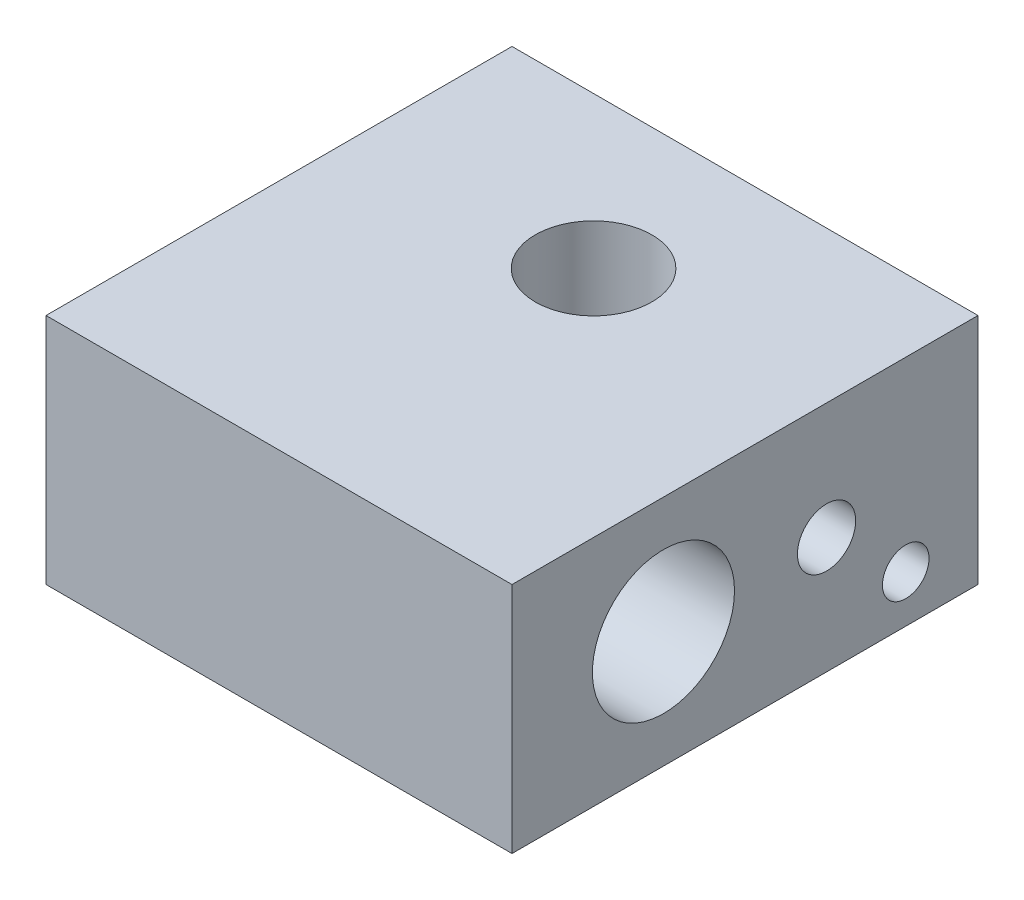
ISO-10303-21;
HEADER;
FILE_DESCRIPTION(('STEP AP214'),'2;1');
FILE_NAME('part.step','',(''),(''),'','','');
FILE_SCHEMA(('AUTOMOTIVE_DESIGN { 1 0 10303 214 1 1 1 1 }'));
ENDSEC;
DATA;
#1=APPLICATION_CONTEXT('core data for automotive mechanical design processes');
#2=APPLICATION_PROTOCOL_DEFINITION('international standard','automotive_design',2000,#1);
#3=PRODUCT_CONTEXT('',#1,'mechanical');
#4=PRODUCT('Part','Part','',(#3));
#5=PRODUCT_RELATED_PRODUCT_CATEGORY('part','',(#4));
#6=PRODUCT_DEFINITION_FORMATION('','',#4);
#7=PRODUCT_DEFINITION_CONTEXT('part definition',#1,'design');
#8=PRODUCT_DEFINITION('design','',#6,#7);
#9=PRODUCT_DEFINITION_SHAPE('','',#8);
#10=(LENGTH_UNIT() NAMED_UNIT(*) SI_UNIT(.MILLI.,.METRE.));
#11=(NAMED_UNIT(*) PLANE_ANGLE_UNIT() SI_UNIT($,.RADIAN.));
#12=(NAMED_UNIT(*) SI_UNIT($,.STERADIAN.) SOLID_ANGLE_UNIT());
#13=UNCERTAINTY_MEASURE_WITH_UNIT(LENGTH_MEASURE(1.E-05),#10,'distance_accuracy_value','');
#14=(GEOMETRIC_REPRESENTATION_CONTEXT(3) GLOBAL_UNCERTAINTY_ASSIGNED_CONTEXT((#13)) GLOBAL_UNIT_ASSIGNED_CONTEXT((#10,
#11,#12)) REPRESENTATION_CONTEXT('',''));
#15=CARTESIAN_POINT('',(0.,0.,0.));
#16=DIRECTION('',(0.,0.,1.));
#17=DIRECTION('',(1.,0.,0.));
#18=AXIS2_PLACEMENT_3D('',#15,#16,#17);
#19=CARTESIAN_POINT('',(-10.,10.,10.));
#20=DIRECTION('',(1.,0.,0.));
#21=DIRECTION('',(0.,0.,-1.));
#22=AXIS2_PLACEMENT_3D('',#19,#20,#21);
#23=PLANE('',#22);
#24=CARTESIAN_POINT('',(-10.,5.,3.5));
#25=DIRECTION('',(1.,0.,0.));
#26=DIRECTION('',(0.,0.,-1.));
#27=AXIS2_PLACEMENT_3D('',#24,#25,#26);
#28=CIRCLE('',#27,3.05);
#29=CARTESIAN_POINT('',(-10.,5.,0.45));
#30=VERTEX_POINT('',#29);
#31=EDGE_CURVE('E106',#30,#30,#28,.T.);
#32=ORIENTED_EDGE('',*,*,#31,.T.);
#33=EDGE_LOOP('',(#32));
#34=FACE_BOUND('',#33,.T.);
#35=DIRECTION('',(0.,0.,1.));
#36=VECTOR('',#35,1.);
#37=CARTESIAN_POINT('',(-10.,0.,10.));
#38=LINE('',#37,#36);
#39=CARTESIAN_POINT('',(-10.,0.,-10.));
#40=VERTEX_POINT('',#39);
#41=CARTESIAN_POINT('',(-10.,0.,10.));
#42=VERTEX_POINT('',#41);
#43=EDGE_CURVE('E87',#40,#42,#38,.T.);
#44=ORIENTED_EDGE('',*,*,#43,.T.);
#45=DIRECTION('',(0.,-1.,0.));
#46=VECTOR('',#45,1.);
#47=CARTESIAN_POINT('',(-10.,10.,10.));
#48=LINE('',#47,#46);
#49=CARTESIAN_POINT('',(-10.,10.,10.));
#50=VERTEX_POINT('',#49);
#51=EDGE_CURVE('E11',#50,#42,#48,.T.);
#52=ORIENTED_EDGE('',*,*,#51,.F.);
#53=DIRECTION('',(0.,0.,1.));
#54=VECTOR('',#53,1.);
#55=CARTESIAN_POINT('',(-10.,10.,10.));
#56=LINE('',#55,#54);
#57=CARTESIAN_POINT('',(-10.,10.,-10.));
#58=VERTEX_POINT('',#57);
#59=EDGE_CURVE('E74',#58,#50,#56,.T.);
#60=ORIENTED_EDGE('',*,*,#59,.F.);
#61=DIRECTION('',(0.,-1.,0.));
#62=VECTOR('',#61,1.);
#63=CARTESIAN_POINT('',(-10.,10.,-10.));
#64=LINE('',#63,#62);
#65=EDGE_CURVE('E83',#58,#40,#64,.T.);
#66=ORIENTED_EDGE('',*,*,#65,.T.);
#67=EDGE_LOOP('',(#44,#52,#60,#66));
#68=FACE_BOUND('',#67,.T.);
#69=ADVANCED_FACE('F17',(#34,#68),#23,.F.);
#70=CARTESIAN_POINT('',(10.,10.,10.));
#71=DIRECTION('',(0.,0.,-1.));
#72=DIRECTION('',(-1.,0.,0.));
#73=AXIS2_PLACEMENT_3D('',#70,#71,#72);
#74=PLANE('',#73);
#75=DIRECTION('',(1.,0.,0.));
#76=VECTOR('',#75,1.);
#77=CARTESIAN_POINT('',(10.,0.,10.));
#78=LINE('',#77,#76);
#79=CARTESIAN_POINT('',(10.,0.,10.));
#80=VERTEX_POINT('',#79);
#81=EDGE_CURVE('E78',#42,#80,#78,.T.);
#82=ORIENTED_EDGE('',*,*,#81,.T.);
#83=DIRECTION('',(0.,-1.,0.));
#84=VECTOR('',#83,1.);
#85=CARTESIAN_POINT('',(10.,10.,10.));
#86=LINE('',#85,#84);
#87=CARTESIAN_POINT('',(10.,10.,10.));
#88=VERTEX_POINT('',#87);
#89=EDGE_CURVE('E31',#88,#80,#86,.T.);
#90=ORIENTED_EDGE('',*,*,#89,.F.);
#91=DIRECTION('',(1.,0.,0.));
#92=VECTOR('',#91,1.);
#93=CARTESIAN_POINT('',(10.,10.,10.));
#94=LINE('',#93,#92);
#95=EDGE_CURVE('E69',#50,#88,#94,.T.);
#96=ORIENTED_EDGE('',*,*,#95,.F.);
#97=ORIENTED_EDGE('',*,*,#51,.T.);
#98=EDGE_LOOP('',(#82,#90,#96,#97));
#99=FACE_BOUND('',#98,.T.);
#100=ADVANCED_FACE('F77',(#99),#74,.F.);
#101=CARTESIAN_POINT('',(10.,10.,10.));
#102=DIRECTION('',(-1.,0.,0.));
#103=DIRECTION('',(0.,0.,1.));
#104=AXIS2_PLACEMENT_3D('',#101,#102,#103);
#105=PLANE('',#104);
#106=CARTESIAN_POINT('',(10.,2.02444947649937,-6.89833512368675));
#107=DIRECTION('',(1.,0.,0.));
#108=DIRECTION('',(0.,0.,-1.));
#109=AXIS2_PLACEMENT_3D('',#106,#107,#108);
#110=CIRCLE('',#109,1.);
#111=CARTESIAN_POINT('',(10.,2.02444947649937,-7.89833512368675));
#112=VERTEX_POINT('',#111);
#113=EDGE_CURVE('E195',#112,#112,#110,.T.);
#114=ORIENTED_EDGE('',*,*,#113,.F.);
#115=EDGE_LOOP('',(#114));
#116=FACE_BOUND('',#115,.T.);
#117=CARTESIAN_POINT('',(10.,5.,-3.5));
#118=DIRECTION('',(1.,0.,0.));
#119=DIRECTION('',(0.,0.,-1.));
#120=AXIS2_PLACEMENT_3D('',#117,#118,#119);
#121=CIRCLE('',#120,1.25);
#122=CARTESIAN_POINT('',(10.,5.,-4.75));
#123=VERTEX_POINT('',#122);
#124=EDGE_CURVE('E190',#123,#123,#121,.T.);
#125=ORIENTED_EDGE('',*,*,#124,.F.);
#126=EDGE_LOOP('',(#125));
#127=FACE_BOUND('',#126,.T.);
#128=CARTESIAN_POINT('',(10.,5.,3.5));
#129=DIRECTION('',(1.,0.,0.));
#130=DIRECTION('',(0.,0.,-1.));
#131=AXIS2_PLACEMENT_3D('',#128,#129,#130);
#132=CIRCLE('',#131,3.05);
#133=CARTESIAN_POINT('',(10.,5.,0.45));
#134=VERTEX_POINT('',#133);
#135=EDGE_CURVE('E109',#134,#134,#132,.T.);
#136=ORIENTED_EDGE('',*,*,#135,.F.);
#137=EDGE_LOOP('',(#136));
#138=FACE_BOUND('',#137,.T.);
#139=DIRECTION('',(0.,0.,-1.));
#140=VECTOR('',#139,1.);
#141=CARTESIAN_POINT('',(10.,0.,10.));
#142=LINE('',#141,#140);
#143=CARTESIAN_POINT('',(10.,0.,-10.));
#144=VERTEX_POINT('',#143);
#145=EDGE_CURVE('E56',#80,#144,#142,.T.);
#146=ORIENTED_EDGE('',*,*,#145,.T.);
#147=DIRECTION('',(0.,-1.,0.));
#148=VECTOR('',#147,1.);
#149=CARTESIAN_POINT('',(10.,10.,-10.));
#150=LINE('',#149,#148);
#151=CARTESIAN_POINT('',(10.,10.,-10.));
#152=VERTEX_POINT('',#151);
#153=EDGE_CURVE('E79',#152,#144,#150,.T.);
#154=ORIENTED_EDGE('',*,*,#153,.F.);
#155=DIRECTION('',(0.,0.,-1.));
#156=VECTOR('',#155,1.);
#157=CARTESIAN_POINT('',(10.,10.,10.));
#158=LINE('',#157,#156);
#159=EDGE_CURVE('E72',#88,#152,#158,.T.);
#160=ORIENTED_EDGE('',*,*,#159,.F.);
#161=ORIENTED_EDGE('',*,*,#89,.T.);
#162=EDGE_LOOP('',(#146,#154,#160,#161));
#163=FACE_BOUND('',#162,.T.);
#164=ADVANCED_FACE('F81',(#116,#127,#138,#163),#105,.F.);
#165=CARTESIAN_POINT('',(10.,10.,-10.));
#166=DIRECTION('',(0.,0.,1.));
#167=DIRECTION('',(1.,0.,0.));
#168=AXIS2_PLACEMENT_3D('',#165,#166,#167);
#169=PLANE('',#168);
#170=DIRECTION('',(-1.,0.,0.));
#171=VECTOR('',#170,1.);
#172=CARTESIAN_POINT('',(10.,0.,-10.));
#173=LINE('',#172,#171);
#174=EDGE_CURVE('E62',#144,#40,#173,.T.);
#175=ORIENTED_EDGE('',*,*,#174,.T.);
#176=ORIENTED_EDGE('',*,*,#65,.F.);
#177=DIRECTION('',(-1.,0.,0.));
#178=VECTOR('',#177,1.);
#179=CARTESIAN_POINT('',(10.,10.,-10.));
#180=LINE('',#179,#178);
#181=EDGE_CURVE('E39',#152,#58,#180,.T.);
#182=ORIENTED_EDGE('',*,*,#181,.F.);
#183=ORIENTED_EDGE('',*,*,#153,.T.);
#184=EDGE_LOOP('',(#175,#176,#182,#183));
#185=FACE_BOUND('',#184,.T.);
#186=ADVANCED_FACE('F95',(#185),#169,.F.);
#187=CARTESIAN_POINT('',(0.,10.,0.));
#188=DIRECTION('',(0.,1.,0.));
#189=DIRECTION('',(0.,0.,1.));
#190=AXIS2_PLACEMENT_3D('',#187,#188,#189);
#191=PLANE('',#190);
#192=CARTESIAN_POINT('',(0.,10.,-3.5));
#193=DIRECTION('',(0.,1.,0.));
#194=DIRECTION('',(0.,0.,1.));
#195=AXIS2_PLACEMENT_3D('',#192,#193,#194);
#196=CIRCLE('',#195,2.5);
#197=CARTESIAN_POINT('',(0.,10.,-1.));
#198=VERTEX_POINT('',#197);
#199=EDGE_CURVE('E103',#198,#198,#196,.T.);
#200=ORIENTED_EDGE('',*,*,#199,.F.);
#201=EDGE_LOOP('',(#200));
#202=FACE_BOUND('',#201,.T.);
#203=ORIENTED_EDGE('',*,*,#59,.T.);
#204=ORIENTED_EDGE('',*,*,#95,.T.);
#205=ORIENTED_EDGE('',*,*,#159,.T.);
#206=ORIENTED_EDGE('',*,*,#181,.T.);
#207=EDGE_LOOP('',(#203,#204,#205,#206));
#208=FACE_BOUND('',#207,.T.);
#209=ADVANCED_FACE('F70',(#202,#208),#191,.T.);
#210=CARTESIAN_POINT('',(0.,0.,0.));
#211=DIRECTION('',(0.,1.,0.));
#212=DIRECTION('',(0.,0.,1.));
#213=AXIS2_PLACEMENT_3D('',#210,#211,#212);
#214=PLANE('',#213);
#215=CARTESIAN_POINT('',(0.,0.,4.));
#216=DIRECTION('',(0.,-1.,0.));
#217=DIRECTION('',(0.,0.,-1.));
#218=AXIS2_PLACEMENT_3D('',#215,#216,#217);
#219=CIRCLE('',#218,1.25);
#220=CARTESIAN_POINT('',(0.,0.,2.75));
#221=VERTEX_POINT('',#220);
#222=EDGE_CURVE('E120',#221,#221,#219,.T.);
#223=ORIENTED_EDGE('',*,*,#222,.F.);
#224=EDGE_LOOP('',(#223));
#225=FACE_BOUND('',#224,.T.);
#226=CARTESIAN_POINT('',(0.,0.,-3.5));
#227=DIRECTION('',(0.,1.,0.));
#228=DIRECTION('',(0.,0.,1.));
#229=AXIS2_PLACEMENT_3D('',#226,#227,#228);
#230=CIRCLE('',#229,2.5);
#231=CARTESIAN_POINT('',(0.,0.,-1.));
#232=VERTEX_POINT('',#231);
#233=EDGE_CURVE('E90',#232,#232,#230,.T.);
#234=ORIENTED_EDGE('',*,*,#233,.T.);
#235=EDGE_LOOP('',(#234));
#236=FACE_BOUND('',#235,.T.);
#237=ORIENTED_EDGE('',*,*,#43,.F.);
#238=ORIENTED_EDGE('',*,*,#174,.F.);
#239=ORIENTED_EDGE('',*,*,#145,.F.);
#240=ORIENTED_EDGE('',*,*,#81,.F.);
#241=EDGE_LOOP('',(#237,#238,#239,#240));
#242=FACE_BOUND('',#241,.T.);
#243=ADVANCED_FACE('F98',(#225,#236,#242),#214,.F.);
#244=CARTESIAN_POINT('',(0.,10.,-3.5));
#245=DIRECTION('',(0.,1.,0.));
#246=DIRECTION('',(0.,0.,1.));
#247=AXIS2_PLACEMENT_3D('',#244,#245,#246);
#248=CYLINDRICAL_SURFACE('',#247,2.5);
#249=CARTESIAN_POINT('',(2.1650635094611,5.,-4.75));
#250=CARTESIAN_POINT('',(2.16506918410574,5.06513476024406,-4.74999545384316));
#251=CARTESIAN_POINT('',(2.16804751484696,5.13035176440631,-4.74487496341652));
#252=CARTESIAN_POINT('',(2.17952958065065,5.25878408084644,-4.72465401237256));
#253=CARTESIAN_POINT('',(2.18804492569449,5.32199489380426,-4.70953258069271));
#254=CARTESIAN_POINT('',(2.20936683256748,5.44431458042992,-4.67012493587476));
#255=CARTESIAN_POINT('',(2.22215054341565,5.50344331559199,-4.64588744061716));
#256=CARTESIAN_POINT('',(2.25053331021072,5.6167802524959,-4.58908440672047));
#257=CARTESIAN_POINT('',(2.26613251845081,5.67098818782807,-4.55651841754471));
#258=CARTESIAN_POINT('',(2.29996086321802,5.77788216069688,-4.48083317566359));
#259=CARTESIAN_POINT('',(2.31830079547442,5.83007391959193,-4.43706504517971));
#260=CARTESIAN_POINT('',(2.35464978482132,5.92676048550839,-4.34156725951808));
#261=CARTESIAN_POINT('',(2.37265867289062,5.9712514532294,-4.28983365722786));
#262=CARTESIAN_POINT('',(2.40776846191186,6.05420893893458,-4.17561195426818));
#263=CARTESIAN_POINT('',(2.42472633022716,6.09206720982441,-4.11263398626572));
#264=CARTESIAN_POINT('',(2.45438445124411,6.1564260665572,-3.98019628324938));
#265=CARTESIAN_POINT('',(2.46708738979677,6.18293382017146,-3.91074067267269));
#266=CARTESIAN_POINT('',(2.48600576555297,6.22188082662637,-3.77255617990747));
#267=CARTESIAN_POINT('',(2.49261850276115,6.23518690794442,-3.70412723811102));
#268=CARTESIAN_POINT('',(2.50009479807584,6.2502076483438,-3.56571328587231));
#269=CARTESIAN_POINT('',(2.50096183480737,6.25192932099463,-3.49572924269533));
#270=CARTESIAN_POINT('',(2.49703727395562,6.24406665753706,-3.36270934447031));
#271=CARTESIAN_POINT('',(2.492731198652,6.23545248059847,-3.29959850102901));
#272=CARTESIAN_POINT('',(2.47967806574684,6.20889894511918,-3.1758577851021));
#273=CARTESIAN_POINT('',(2.47093067582992,6.19095888877972,-3.1152280986326));
#274=CARTESIAN_POINT('',(2.44964479109568,6.14614679238773,-2.99711326053806));
#275=CARTESIAN_POINT('',(2.43705551911499,6.11915460853492,-2.93968322060603));
#276=CARTESIAN_POINT('',(2.40922057483359,6.05717072974813,-2.83002899810834));
#277=CARTESIAN_POINT('',(2.39397395196855,6.02217617087205,-2.7778066889517));
#278=CARTESIAN_POINT('',(2.36055492999036,5.94138081058372,-2.67478292387726));
#279=CARTESIAN_POINT('',(2.34224219997719,5.89487121459248,-2.6245824062133));
#280=CARTESIAN_POINT('',(2.30567925733514,5.79426284383728,-2.53236953712777));
#281=CARTESIAN_POINT('',(2.28742910332036,5.74015828465742,-2.49036348553221));
#282=CARTESIAN_POINT('',(2.25180195115606,5.62168975946988,-2.41311833169724));
#283=CARTESIAN_POINT('',(2.23455399988384,5.55689247118223,-2.37847835627743));
#284=CARTESIAN_POINT('',(2.2046931284822,5.42132791080125,-2.32085110874846));
#285=CARTESIAN_POINT('',(2.19207537557584,5.35056695872804,-2.29785167723639));
#286=CARTESIAN_POINT('',(2.17430794771293,5.21098186089651,-2.26602473621871));
#287=CARTESIAN_POINT('',(2.1686456981062,5.14244860119556,-2.25621859735003));
#288=CARTESIAN_POINT('',(2.16397399202012,5.00449832310433,-2.24810381673572));
#289=CARTESIAN_POINT('',(2.1649598361164,4.93508196360027,-2.24978705335622));
#290=CARTESIAN_POINT('',(2.17292920675731,4.80543260177659,-2.26370494582005));
#291=CARTESIAN_POINT('',(2.17924484383318,4.74502568611509,-2.27476522910941));
#292=CARTESIAN_POINT('',(2.19617526939176,4.62704026716131,-2.30537964420945));
#293=CARTESIAN_POINT('',(2.20679145006292,4.56946268656675,-2.32493652672049));
#294=CARTESIAN_POINT('',(2.23170277599571,4.45573583637163,-2.3729405142439));
#295=CARTESIAN_POINT('',(2.24614554053829,4.39977622893306,-2.4017574203841));
#296=CARTESIAN_POINT('',(2.27695149371562,4.29316341057626,-2.46714116998024));
#297=CARTESIAN_POINT('',(2.29331566693934,4.2425129456084,-2.50371199458474));
#298=CARTESIAN_POINT('',(2.3285999807042,4.14127654059557,-2.58895354100144));
#299=CARTESIAN_POINT('',(2.34758228942861,4.09150356160293,-2.63856840960629));
#300=CARTESIAN_POINT('',(2.38417793722365,4.00073470250801,-2.74574438075214));
#301=CARTESIAN_POINT('',(2.40179081259636,3.95974178721183,-2.80330815668082));
#302=CARTESIAN_POINT('',(2.43426702113696,3.88678284256238,-2.92683079680156));
#303=CARTESIAN_POINT('',(2.44904552090037,3.85508360223636,-2.99297112803236));
#304=CARTESIAN_POINT('',(2.47354193699126,3.80357762017826,-3.13059704419865));
#305=CARTESIAN_POINT('',(2.48326429595466,3.78376043579212,-3.20207787325978));
#306=CARTESIAN_POINT('',(2.49584385227353,3.75828929478168,-3.34127539708698));
#307=CARTESIAN_POINT('',(2.49924909885239,3.75150265515486,-3.40873569518693));
#308=CARTESIAN_POINT('',(2.50052662968914,3.748945918182,-3.54390748243901));
#309=CARTESIAN_POINT('',(2.49840085083612,3.75317196434555,-3.61161887536886));
#310=CARTESIAN_POINT('',(2.48917461047403,3.77177050849454,-3.74067249039644));
#311=CARTESIAN_POINT('',(2.48241118334987,3.78545606157209,-3.80214039726408));
#312=CARTESIAN_POINT('',(2.46490117079279,3.82165874912871,-3.92180744022953));
#313=CARTESIAN_POINT('',(2.45415401415994,3.84417715011682,-3.98000610619439));
#314=CARTESIAN_POINT('',(2.4290741343515,3.89840881520747,-4.09427925780611));
#315=CARTESIAN_POINT('',(2.41460771498499,3.9304741540098,-4.15015642837506));
#316=CARTESIAN_POINT('',(2.38360166427283,4.00244741357382,-4.25596830226753));
#317=CARTESIAN_POINT('',(2.36706108197951,4.0423589363946,-4.30590025926864));
#318=CARTESIAN_POINT('',(2.33160762783285,4.13349642377838,-4.40364250519611));
#319=CARTESIAN_POINT('',(2.31262248764622,4.18545310934649,-4.45074710567409));
#320=CARTESIAN_POINT('',(2.27578845203565,4.29681340141221,-4.53582910924334));
#321=CARTESIAN_POINT('',(2.25794057202332,4.35622352608461,-4.57379843751257));
#322=CARTESIAN_POINT('',(2.22499506631145,4.4832958082262,-4.64053884973206));
#323=CARTESIAN_POINT('',(2.21000217820338,4.55115941391092,-4.66898133245118));
#324=CARTESIAN_POINT('',(2.18582695410439,4.69166550542472,-4.71359838688301));
#325=CARTESIAN_POINT('',(2.17662520184627,4.76429111114086,-4.72981398896917));
#326=CARTESIAN_POINT('',(2.16911590752238,4.864756694565,-4.74295875983051));
#327=CARTESIAN_POINT('',(2.1676016125644,4.89170986799735,-4.74559513120481));
#328=CARTESIAN_POINT('',(2.16557419859688,4.9457706008528,-4.74911675636246));
#329=CARTESIAN_POINT('',(2.16506114656387,4.97287817048234,-4.75000189299984));
#330=CARTESIAN_POINT('',(2.1650635094611,5.,-4.75));
#331=B_SPLINE_CURVE_WITH_KNOTS('',3,(#249,#250,#251,#252,#253,#254,#255,#256,#257,#258,#259,
#260,#261,#262,#263,#264,#265,#266,#267,#268,#269,#270,#271,#272,#273,#274,#275,#276,#277,#278,
#279,#280,#281,#282,#283,#284,#285,#286,#287,#288,#289,#290,#291,#292,#293,#294,#295,#296,#297,
#298,#299,#300,#301,#302,#303,#304,#305,#306,#307,#308,#309,#310,#311,#312,#313,#314,#315,#316,
#317,#318,#319,#320,#321,#322,#323,#324,#325,#326,#327,#328,#329,#330),.UNSPECIFIED.,.T.,.F.,(4,
2,2,2,2,2,2,2,2,2,2,2,2,2,2,2,2,2,2,2,2,2,2,2,2,2,2,2,2,2,2,2,2,2,2,2,2,2,2,2,4),(0.,
0.195290153243392,0.390991116031006,0.585660744898607,0.780340906806435,0.991077890622791,
1.20191963855464,1.42697365298454,1.65188533704863,1.86079356209919,2.0695752960755,
2.26020121855673,2.45084140646818,2.64411918413933,2.83746624187839,3.04908989321113,
3.26087560307398,3.4861105216181,3.7111096776463,3.91827863567764,4.12530116485465,
4.3096772928003,4.49411315545077,4.68709120507608,4.88016857775058,5.09758429475765,
5.31507331222751,5.53830226766206,5.76133474760963,5.96390337986857,6.16640108492463,
6.35555531089364,6.54473666890015,6.74200938399339,6.93937287625897,7.15637802312583,
7.37357428556441,7.59763436298254,7.82093916253448,7.90225168981634,7.98356965618173),.UNSPECIFIED.);
#332=CARTESIAN_POINT('',(2.1650635094611,5.,-4.75));
#333=VERTEX_POINT('',#332);
#334=EDGE_CURVE('E20',#333,#333,#331,.T.);
#335=ORIENTED_EDGE('',*,*,#334,.T.);
#336=EDGE_LOOP('',(#335));
#337=FACE_BOUND('',#336,.T.);
#338=ORIENTED_EDGE('',*,*,#233,.F.);
#339=EDGE_LOOP('',(#338));
#340=FACE_BOUND('',#339,.T.);
#341=ORIENTED_EDGE('',*,*,#199,.T.);
#342=EDGE_LOOP('',(#341));
#343=FACE_BOUND('',#342,.T.);
#344=ADVANCED_FACE('F156',(#337,#340,#343),#248,.F.);
#345=CARTESIAN_POINT('',(-10.,5.,3.5));
#346=DIRECTION('',(1.,0.,0.));
#347=DIRECTION('',(0.,0.,-1.));
#348=AXIS2_PLACEMENT_3D('',#345,#346,#347);
#349=CYLINDRICAL_SURFACE('',#348,3.05);
#350=CARTESIAN_POINT('',(0.,2.0436509001811,2.75));
#351=CARTESIAN_POINT('',(0.0692085637528793,2.04364774492933,2.75000357568392));
#352=CARTESIAN_POINT('',(0.138501698214284,2.04216752406256,2.75577387142863));
#353=CARTESIAN_POINT('',(0.275154268614018,2.03649886697814,2.77868586426858));
#354=CARTESIAN_POINT('',(0.342509609643591,2.03230508099345,2.79585002599552));
#355=CARTESIAN_POINT('',(0.473195704149625,2.02196221981633,2.84096888337084));
#356=CARTESIAN_POINT('',(0.536534048355299,2.01581697280935,2.86890247537986));
#357=CARTESIAN_POINT('',(0.657656087650381,2.0026472442172,2.93475740563173));
#358=CARTESIAN_POINT('',(0.715440908886911,1.99562294155544,2.97267671310686));
#359=CARTESIAN_POINT('',(0.825120905094107,1.98182094027218,3.0583968784845));
#360=CARTESIAN_POINT('',(0.876872922433237,1.97505112849412,3.10638248812097));
#361=CARTESIAN_POINT('',(0.971671931388283,1.96331942580585,3.21050078286827));
#362=CARTESIAN_POINT('',(1.01471912000628,1.95835749397883,3.2666332835545));
#363=CARTESIAN_POINT('',(1.09048603142752,1.95159849087135,3.3849930055991));
#364=CARTESIAN_POINT('',(1.12329099306028,1.94977469519243,3.44716395051576));
#365=CARTESIAN_POINT('',(1.17801140092474,1.95026967735108,3.5761030792318));
#366=CARTESIAN_POINT('',(1.19993146140669,1.95258669792417,3.64286930134363));
#367=CARTESIAN_POINT('',(1.23146207223003,1.96177374289028,3.77546327842864));
#368=CARTESIAN_POINT('',(1.24162354741111,1.96841492396218,3.84117649796948));
#369=CARTESIAN_POINT('',(1.25144429115576,1.98613411646346,3.97277847350475));
#370=CARTESIAN_POINT('',(1.25110401842469,1.99721193408434,4.03866722170658));
#371=CARTESIAN_POINT('',(1.24032868880418,2.02335241665559,4.16812590041926));
#372=CARTESIAN_POINT('',(1.22998957308695,2.03837622162456,4.23171191429621));
#373=CARTESIAN_POINT('',(1.2000171042775,2.07179496581687,4.3557125913725));
#374=CARTESIAN_POINT('',(1.18038164108417,2.09019066981845,4.41612653110865));
#375=CARTESIAN_POINT('',(1.13092721201586,2.13083863890296,4.53669611078227));
#376=CARTESIAN_POINT('',(1.10049117784445,2.15327079954552,4.59653712894476));
#377=CARTESIAN_POINT('',(1.0308042439367,2.19970058224955,4.71020685262237));
#378=CARTESIAN_POINT('',(0.991546454415896,2.22369941743236,4.76403080934811));
#379=CARTESIAN_POINT('',(0.900769481797315,2.27418106594349,4.86973274752629));
#380=CARTESIAN_POINT('',(0.848423809963845,2.30067589131907,4.92089786039773));
#381=CARTESIAN_POINT('',(0.73500767495293,2.35161241734168,5.01371960509979));
#382=CARTESIAN_POINT('',(0.673941031419302,2.37605500943017,5.05538037903531));
#383=CARTESIAN_POINT('',(0.554815983802851,2.41671041429424,5.12184399782327));
#384=CARTESIAN_POINT('',(0.497914216814822,2.43361559216795,5.14829243894248));
#385=CARTESIAN_POINT('',(0.379712711132388,2.46261649943013,5.19259862915102));
#386=CARTESIAN_POINT('',(0.318417583500931,2.47471718659349,5.21046523788632));
#387=CARTESIAN_POINT('',(0.192493057456599,2.49273325261251,5.23677206609756));
#388=CARTESIAN_POINT('',(0.127844814183392,2.49860850962077,5.24515116360212));
#389=CARTESIAN_POINT('',(-0.00221623587057637,2.5031818572001,5.25169033405053));
#390=CARTESIAN_POINT('',(-0.0676287337584259,2.50188275371779,5.24985440216749));
#391=CARTESIAN_POINT('',(-0.189968922767873,2.49282910433508,5.23684798854709));
#392=CARTESIAN_POINT('',(-0.247061825231091,2.48577243409748,5.22668615591458));
#393=CARTESIAN_POINT('',(-0.358550655020001,2.46688262886872,5.19885162470666));
#394=CARTESIAN_POINT('',(-0.412945667100691,2.45504788521899,5.1811763964516));
#395=CARTESIAN_POINT('',(-0.521016604909722,2.42691618012899,5.13781588590519));
#396=CARTESIAN_POINT('',(-0.57447402189155,2.41040296780109,5.11173077255986));
#397=CARTESIAN_POINT('',(-0.676489990475305,2.37462841741335,5.05277587882737));
#398=CARTESIAN_POINT('',(-0.725046113946462,2.35536572854249,5.01990275994291));
#399=CARTESIAN_POINT('',(-0.824492618518227,2.31197700790472,4.94199077517853));
#400=CARTESIAN_POINT('',(-0.874391710023356,2.28757911211235,4.89583486473667));
#401=CARTESIAN_POINT('',(-0.966062517234581,2.23854182442011,4.79612501752129));
#402=CARTESIAN_POINT('',(-1.00782828984127,2.21390226964348,4.74256571951435));
#403=CARTESIAN_POINT('',(-1.0860431772959,2.16360335825816,4.62335740279802));
#404=CARTESIAN_POINT('',(-1.12156790870199,2.13808132956404,4.5570377133225));
#405=CARTESIAN_POINT('',(-1.18043955978326,2.09051517856197,4.41803234675883));
#406=CARTESIAN_POINT('',(-1.20379158760866,2.06846960011059,4.34534935494464));
#407=CARTESIAN_POINT('',(-1.23609185417266,2.03042001612153,4.1996144636949));
#408=CARTESIAN_POINT('',(-1.24573824409553,2.01415762573635,4.12678651727926));
#409=CARTESIAN_POINT('',(-1.25199743186358,1.98701537772641,3.97959257039941));
#410=CARTESIAN_POINT('',(-1.24862004550999,1.97613147340443,3.90522777026693));
#411=CARTESIAN_POINT('',(-1.22954608234491,1.96079695110458,3.76500650120458));
#412=CARTESIAN_POINT('',(-1.21509886147904,1.95581721379996,3.69903496051038));
#413=CARTESIAN_POINT('',(-1.17568993321184,1.9501239112459,3.57012378475261));
#414=CARTESIAN_POINT('',(-1.15072924512929,1.94940993251755,3.50718385642229));
#415=CARTESIAN_POINT('',(-1.09177836977678,1.95149473248206,3.38775400401996));
#416=CARTESIAN_POINT('',(-1.05803264416982,1.95420508250385,3.33114116992635));
#417=CARTESIAN_POINT('',(-0.982176406906799,1.9620360317787,3.22402422766701));
#418=CARTESIAN_POINT('',(-0.940064813555239,1.96715694283145,3.17352091081373));
#419=CARTESIAN_POINT('',(-0.846571987527884,1.97896338568033,3.07778330960818));
#420=CARTESIAN_POINT('',(-0.794869431578524,1.98570684569804,3.03286998505551));
#421=CARTESIAN_POINT('',(-0.684816901774183,1.99934326271401,2.95205474177007));
#422=CARTESIAN_POINT('',(-0.62646283548654,2.00623630961329,2.91615841485156));
#423=CARTESIAN_POINT('',(-0.502502489510212,2.01917594209208,2.85327151929729));
#424=CARTESIAN_POINT('',(-0.436716639434085,2.02518559786309,2.82662681028308));
#425=CARTESIAN_POINT('',(-0.301519864530307,2.03494703812285,2.78485755690373));
#426=CARTESIAN_POINT('',(-0.232116958991415,2.03870360427824,2.76970859717884));
#427=CARTESIAN_POINT('',(-0.135131201126297,2.04187508104678,2.75702943868167));
#428=CARTESIAN_POINT('',(-0.108180437632344,2.04253861453597,2.75439585498109));
#429=CARTESIAN_POINT('',(-0.0541574342672176,2.04342714306173,2.75088042978552));
#430=CARTESIAN_POINT('',(-0.0270851935414004,2.04365213500813,2.74999860063429));
#431=CARTESIAN_POINT('',(0.,2.0436509001811,2.75));
#432=B_SPLINE_CURVE_WITH_KNOTS('',3,(#350,#351,#352,#353,#354,#355,#356,#357,#358,#359,#360,
#361,#362,#363,#364,#365,#366,#367,#368,#369,#370,#371,#372,#373,#374,#375,#376,#377,#378,#379,
#380,#381,#382,#383,#384,#385,#386,#387,#388,#389,#390,#391,#392,#393,#394,#395,#396,#397,#398,
#399,#400,#401,#402,#403,#404,#405,#406,#407,#408,#409,#410,#411,#412,#413,#414,#415,#416,#417,
#418,#419,#420,#421,#422,#423,#424,#425,#426,#427,#428,#429,#430,#431),.UNSPECIFIED.,.T.,.F.,(4,
2,2,2,2,2,2,2,2,2,2,2,2,2,2,2,2,2,2,2,2,2,2,2,2,2,2,2,2,2,2,2,2,2,2,2,2,2,2,2,4),(0.,
0.207521078186046,0.415452533881008,0.622978583917322,0.830462462495352,1.04215285296592,
1.25383845205956,1.46371224437075,1.67349699235719,1.87299425787793,2.07248280957905,
2.27007602229118,2.46771410657175,2.67919847243154,2.8908485850468,3.1233289664219,
3.35570783568164,3.5498737985791,3.74383887677231,3.93904656220658,4.13417790584762,
4.30865425934157,4.48318940373795,4.66769299443992,4.85228754531396,5.06806503568652,
5.28399961007477,5.52113145644522,5.75816371259609,5.98262637921949,6.20691990518158,
6.40906615373175,6.61119280797951,6.80820490678366,7.00524249558745,7.21077340847468,
7.41643146667939,7.6291103006208,7.84133616046531,7.92255022785144,8.00376486751162),.UNSPECIFIED.);
#433=CARTESIAN_POINT('',(0.,2.0436509001811,2.75));
#434=VERTEX_POINT('',#433);
#435=EDGE_CURVE('E112',#434,#434,#432,.T.);
#436=ORIENTED_EDGE('',*,*,#435,.T.);
#437=EDGE_LOOP('',(#436));
#438=FACE_BOUND('',#437,.T.);
#439=ORIENTED_EDGE('',*,*,#31,.F.);
#440=EDGE_LOOP('',(#439));
#441=FACE_BOUND('',#440,.T.);
#442=ORIENTED_EDGE('',*,*,#135,.T.);
#443=EDGE_LOOP('',(#442));
#444=FACE_BOUND('',#443,.T.);
#445=ADVANCED_FACE('F128',(#438,#441,#444),#349,.F.);
#446=CARTESIAN_POINT('',(0.,0.,4.));
#447=DIRECTION('',(0.,-1.,0.));
#448=DIRECTION('',(0.,0.,-1.));
#449=AXIS2_PLACEMENT_3D('',#446,#447,#448);
#450=CYLINDRICAL_SURFACE('',#449,1.25);
#451=ORIENTED_EDGE('',*,*,#435,.F.);
#452=EDGE_LOOP('',(#451));
#453=FACE_BOUND('',#452,.T.);
#454=ORIENTED_EDGE('',*,*,#222,.T.);
#455=EDGE_LOOP('',(#454));
#456=FACE_BOUND('',#455,.T.);
#457=ADVANCED_FACE('F124',(#453,#456),#450,.F.);
#458=CARTESIAN_POINT('',(10.,5.,-3.5));
#459=DIRECTION('',(1.,0.,0.));
#460=DIRECTION('',(0.,0.,-1.));
#461=AXIS2_PLACEMENT_3D('',#458,#459,#460);
#462=CYLINDRICAL_SURFACE('',#461,1.25);
#463=ORIENTED_EDGE('',*,*,#124,.T.);
#464=EDGE_LOOP('',(#463));
#465=FACE_BOUND('',#464,.T.);
#466=ORIENTED_EDGE('',*,*,#334,.F.);
#467=EDGE_LOOP('',(#466));
#468=FACE_BOUND('',#467,.T.);
#469=ADVANCED_FACE('F127',(#465,#468),#462,.F.);
#470=CARTESIAN_POINT('',(5.,2.02444947649937,-6.89833512368675));
#471=DIRECTION('',(1.,0.,0.));
#472=DIRECTION('',(0.,0.,-1.));
#473=AXIS2_PLACEMENT_3D('',#470,#471,#472);
#474=CYLINDRICAL_SURFACE('',#473,1.);
#475=CARTESIAN_POINT('',(5.,2.02444947649937,-6.89833512368675));
#476=DIRECTION('',(1.,0.,0.));
#477=DIRECTION('',(0.,0.,-1.));
#478=AXIS2_PLACEMENT_3D('',#475,#476,#477);
#479=CIRCLE('',#478,1.);
#480=CARTESIAN_POINT('',(5.,2.02444947649937,-7.89833512368675));
#481=VERTEX_POINT('',#480);
#482=EDGE_CURVE('E193',#481,#481,#479,.T.);
#483=ORIENTED_EDGE('',*,*,#482,.F.);
#484=EDGE_LOOP('',(#483));
#485=FACE_BOUND('',#484,.T.);
#486=ORIENTED_EDGE('',*,*,#113,.T.);
#487=EDGE_LOOP('',(#486));
#488=FACE_BOUND('',#487,.T.);
#489=ADVANCED_FACE('F133',(#485,#488),#474,.F.);
#490=CARTESIAN_POINT('',(5.,2.02444947649937,-6.89833512368675));
#491=DIRECTION('',(1.,0.,0.));
#492=DIRECTION('',(0.,0.,-1.));
#493=AXIS2_PLACEMENT_3D('',#490,#491,#492);
#494=PLANE('',#493);
#495=ORIENTED_EDGE('',*,*,#482,.T.);
#496=EDGE_LOOP('',(#495));
#497=FACE_BOUND('',#496,.T.);
#498=ADVANCED_FACE('F137',(#497),#494,.T.);
#499=CLOSED_SHELL('',(#69,#100,#164,#186,#209,#243,#344,#445,#457,#469,#489,#498));
#500=MANIFOLD_SOLID_BREP('B1',#499);
#501=ADVANCED_BREP_SHAPE_REPRESENTATION('',(#18,#500),#14);
#502=SHAPE_DEFINITION_REPRESENTATION(#9,#501);
ENDSEC;
END-ISO-10303-21;
